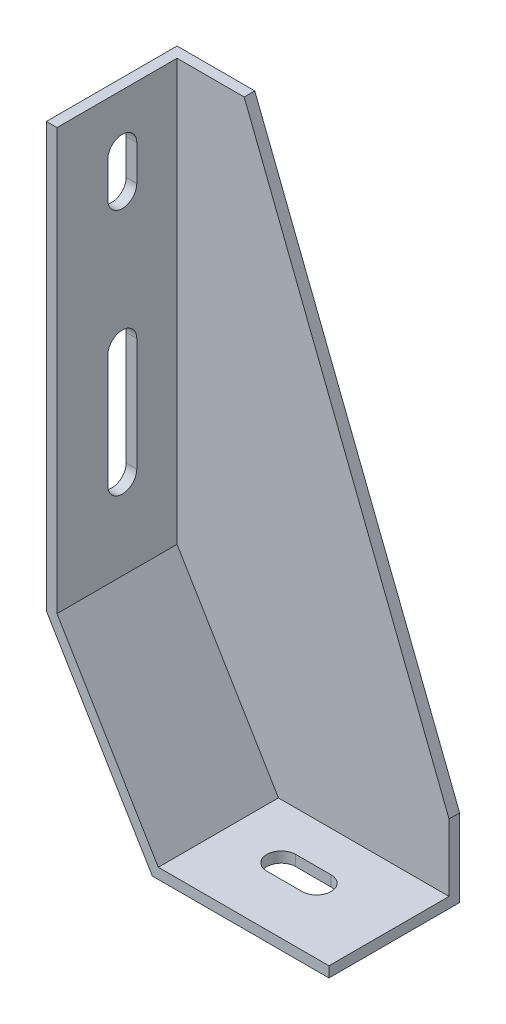
ISO-10303-21;
HEADER;
FILE_DESCRIPTION(('STEP AP214'),'2;1');
FILE_NAME('part.step','',(''),(''),'','','');
FILE_SCHEMA(('AUTOMOTIVE_DESIGN { 1 0 10303 214 1 1 1 1 }'));
ENDSEC;
DATA;
#1=APPLICATION_CONTEXT('core data for automotive mechanical design processes');
#2=APPLICATION_PROTOCOL_DEFINITION('international standard','automotive_design',2000,#1);
#3=PRODUCT_CONTEXT('',#1,'mechanical');
#4=PRODUCT('Part','Part','',(#3));
#5=PRODUCT_RELATED_PRODUCT_CATEGORY('part','',(#4));
#6=PRODUCT_DEFINITION_FORMATION('','',#4);
#7=PRODUCT_DEFINITION_CONTEXT('part definition',#1,'design');
#8=PRODUCT_DEFINITION('design','',#6,#7);
#9=PRODUCT_DEFINITION_SHAPE('','',#8);
#10=(LENGTH_UNIT() NAMED_UNIT(*) SI_UNIT(.MILLI.,.METRE.));
#11=(NAMED_UNIT(*) PLANE_ANGLE_UNIT() SI_UNIT($,.RADIAN.));
#12=(NAMED_UNIT(*) SI_UNIT($,.STERADIAN.) SOLID_ANGLE_UNIT());
#13=UNCERTAINTY_MEASURE_WITH_UNIT(LENGTH_MEASURE(1.E-05),#10,'distance_accuracy_value','');
#14=(GEOMETRIC_REPRESENTATION_CONTEXT(3) GLOBAL_UNCERTAINTY_ASSIGNED_CONTEXT((#13)) GLOBAL_UNIT_ASSIGNED_CONTEXT((#10,
#11,#12)) REPRESENTATION_CONTEXT('',''));
#15=CARTESIAN_POINT('',(0.,0.,0.));
#16=DIRECTION('',(0.,0.,1.));
#17=DIRECTION('',(1.,0.,0.));
#18=AXIS2_PLACEMENT_3D('',#15,#16,#17);
#19=CARTESIAN_POINT('',(0.,3.,37.));
#20=DIRECTION('',(0.,-1.,0.));
#21=DIRECTION('',(0.,0.,-1.));
#22=AXIS2_PLACEMENT_3D('',#19,#20,#21);
#23=PLANE('',#22);
#24=DIRECTION('',(-1.,0.,0.));
#25=VECTOR('',#24,1.);
#26=CARTESIAN_POINT('',(-22.,3.,14.4));
#27=LINE('',#26,#25);
#28=CARTESIAN_POINT('',(-22.,3.,14.4));
#29=VERTEX_POINT('',#28);
#30=CARTESIAN_POINT('',(-32.,3.,14.4));
#31=VERTEX_POINT('',#30);
#32=EDGE_CURVE('E210',#29,#31,#27,.T.);
#33=ORIENTED_EDGE('',*,*,#32,.F.);
#34=CARTESIAN_POINT('',(-22.,3.,18.5));
#35=DIRECTION('',(0.,1.,0.));
#36=DIRECTION('',(0.,0.,1.));
#37=AXIS2_PLACEMENT_3D('',#34,#35,#36);
#38=CIRCLE('',#37,4.1);
#39=CARTESIAN_POINT('',(-22.,3.,22.6));
#40=VERTEX_POINT('',#39);
#41=EDGE_CURVE('E50',#40,#29,#38,.T.);
#42=ORIENTED_EDGE('',*,*,#41,.F.);
#43=DIRECTION('',(1.,0.,0.));
#44=VECTOR('',#43,1.);
#45=CARTESIAN_POINT('',(-22.,3.,22.6));
#46=LINE('',#45,#44);
#47=CARTESIAN_POINT('',(-32.,3.,22.6));
#48=VERTEX_POINT('',#47);
#49=EDGE_CURVE('E201',#48,#40,#46,.T.);
#50=ORIENTED_EDGE('',*,*,#49,.F.);
#51=CARTESIAN_POINT('',(-32.,3.,18.5));
#52=DIRECTION('',(0.,1.,0.));
#53=DIRECTION('',(0.,0.,1.));
#54=AXIS2_PLACEMENT_3D('',#51,#52,#53);
#55=CIRCLE('',#54,4.1);
#56=EDGE_CURVE('E204',#31,#48,#55,.T.);
#57=ORIENTED_EDGE('',*,*,#56,.F.);
#58=EDGE_LOOP('',(#33,#42,#50,#57));
#59=FACE_BOUND('',#58,.T.);
#60=DIRECTION('',(-1.,0.,0.));
#61=VECTOR('',#60,1.);
#62=CARTESIAN_POINT('',(0.,3.,3.));
#63=LINE('',#62,#61);
#64=CARTESIAN_POINT('',(0.,3.,3.));
#65=VERTEX_POINT('',#64);
#66=CARTESIAN_POINT('',(-48.3014288630927,3.,3.));
#67=VERTEX_POINT('',#66);
#68=EDGE_CURVE('E295',#65,#67,#63,.T.);
#69=ORIENTED_EDGE('',*,*,#68,.T.);
#70=DIRECTION('',(0.,0.,-1.));
#71=VECTOR('',#70,1.);
#72=CARTESIAN_POINT('',(-48.3014288630927,3.,37.));
#73=LINE('',#72,#71);
#74=CARTESIAN_POINT('',(-48.3014288630927,3.,37.));
#75=VERTEX_POINT('',#74);
#76=EDGE_CURVE('E43',#75,#67,#73,.T.);
#77=ORIENTED_EDGE('',*,*,#76,.F.);
#78=DIRECTION('',(-1.,0.,0.));
#79=VECTOR('',#78,1.);
#80=CARTESIAN_POINT('',(0.,3.,37.));
#81=LINE('',#80,#79);
#82=CARTESIAN_POINT('',(0.,3.,37.));
#83=VERTEX_POINT('',#82);
#84=EDGE_CURVE('E311',#83,#75,#81,.T.);
#85=ORIENTED_EDGE('',*,*,#84,.F.);
#86=DIRECTION('',(0.,0.,-1.));
#87=VECTOR('',#86,1.);
#88=CARTESIAN_POINT('',(0.,3.,37.));
#89=LINE('',#88,#87);
#90=EDGE_CURVE('E11',#83,#65,#89,.T.);
#91=ORIENTED_EDGE('',*,*,#90,.T.);
#92=EDGE_LOOP('',(#69,#77,#85,#91));
#93=FACE_BOUND('',#92,.T.);
#94=ADVANCED_FACE('F35',(#59,#93),#23,.F.);
#95=CARTESIAN_POINT('',(-48.3014288630927,3.,37.));
#96=DIRECTION('',(-0.857492925712544,-0.514495755427527,0.));
#97=DIRECTION('',(0.514495755427527,-0.857492925712544,0.));
#98=AXIS2_PLACEMENT_3D('',#95,#96,#97);
#99=PLANE('',#98);
#100=DIRECTION('',(-0.514495755427527,0.857492925712544,0.));
#101=VECTOR('',#100,1.);
#102=CARTESIAN_POINT('',(-48.3014288630927,3.,3.));
#103=LINE('',#102,#101);
#104=CARTESIAN_POINT('',(-77.,50.8309518948454,3.));
#105=VERTEX_POINT('',#104);
#106=EDGE_CURVE('E297',#67,#105,#103,.T.);
#107=ORIENTED_EDGE('',*,*,#106,.T.);
#108=DIRECTION('',(0.,0.,-1.));
#109=VECTOR('',#108,1.);
#110=CARTESIAN_POINT('',(-77.,50.8309518948454,37.));
#111=LINE('',#110,#109);
#112=CARTESIAN_POINT('',(-77.,50.8309518948454,37.));
#113=VERTEX_POINT('',#112);
#114=EDGE_CURVE('E349',#113,#105,#111,.T.);
#115=ORIENTED_EDGE('',*,*,#114,.F.);
#116=DIRECTION('',(-0.514495755427527,0.857492925712544,0.));
#117=VECTOR('',#116,1.);
#118=CARTESIAN_POINT('',(-48.3014288630927,3.,37.));
#119=LINE('',#118,#117);
#120=EDGE_CURVE('E314',#75,#113,#119,.T.);
#121=ORIENTED_EDGE('',*,*,#120,.F.);
#122=ORIENTED_EDGE('',*,*,#76,.T.);
#123=EDGE_LOOP('',(#107,#115,#121,#122));
#124=FACE_BOUND('',#123,.T.);
#125=ADVANCED_FACE('F356',(#124),#99,.F.);
#126=CARTESIAN_POINT('',(-77.,50.8309518948454,37.));
#127=DIRECTION('',(-1.,0.,0.));
#128=DIRECTION('',(0.,0.,1.));
#129=AXIS2_PLACEMENT_3D('',#126,#127,#128);
#130=PLANE('',#129);
#131=DIRECTION('',(0.,-1.,0.));
#132=VECTOR('',#131,1.);
#133=CARTESIAN_POINT('',(-77.,107.,22.6));
#134=LINE('',#133,#132);
#135=CARTESIAN_POINT('',(-77.,107.,22.6));
#136=VERTEX_POINT('',#135);
#137=CARTESIAN_POINT('',(-77.,75.,22.6));
#138=VERTEX_POINT('',#137);
#139=EDGE_CURVE('E235',#136,#138,#134,.T.);
#140=ORIENTED_EDGE('',*,*,#139,.F.);
#141=CARTESIAN_POINT('',(-77.,107.,18.5));
#142=DIRECTION('',(1.,0.,0.));
#143=DIRECTION('',(0.,0.,-1.));
#144=AXIS2_PLACEMENT_3D('',#141,#142,#143);
#145=CIRCLE('',#144,4.1);
#146=CARTESIAN_POINT('',(-77.,107.,14.4));
#147=VERTEX_POINT('',#146);
#148=EDGE_CURVE('E216',#147,#136,#145,.T.);
#149=ORIENTED_EDGE('',*,*,#148,.F.);
#150=DIRECTION('',(0.,1.,0.));
#151=VECTOR('',#150,1.);
#152=CARTESIAN_POINT('',(-77.,107.,14.4));
#153=LINE('',#152,#151);
#154=CARTESIAN_POINT('',(-77.,75.,14.4));
#155=VERTEX_POINT('',#154);
#156=EDGE_CURVE('E224',#155,#147,#153,.T.);
#157=ORIENTED_EDGE('',*,*,#156,.F.);
#158=CARTESIAN_POINT('',(-77.,75.,18.5));
#159=DIRECTION('',(1.,0.,0.));
#160=DIRECTION('',(0.,0.,-1.));
#161=AXIS2_PLACEMENT_3D('',#158,#159,#160);
#162=CIRCLE('',#161,4.1);
#163=EDGE_CURVE('E238',#138,#155,#162,.T.);
#164=ORIENTED_EDGE('',*,*,#163,.F.);
#165=EDGE_LOOP('',(#140,#149,#157,#164));
#166=FACE_BOUND('',#165,.T.);
#167=DIRECTION('',(0.,-1.,0.));
#168=VECTOR('',#167,1.);
#169=CARTESIAN_POINT('',(-77.,155.,22.6));
#170=LINE('',#169,#168);
#171=CARTESIAN_POINT('',(-77.,155.,22.6));
#172=VERTEX_POINT('',#171);
#173=CARTESIAN_POINT('',(-77.,145.,22.6));
#174=VERTEX_POINT('',#173);
#175=EDGE_CURVE('E267',#172,#174,#170,.T.);
#176=ORIENTED_EDGE('',*,*,#175,.F.);
#177=CARTESIAN_POINT('',(-77.,155.,18.5));
#178=DIRECTION('',(1.,0.,0.));
#179=DIRECTION('',(0.,0.,-1.));
#180=AXIS2_PLACEMENT_3D('',#177,#178,#179);
#181=CIRCLE('',#180,4.1);
#182=CARTESIAN_POINT('',(-77.,155.,14.4));
#183=VERTEX_POINT('',#182);
#184=EDGE_CURVE('E245',#183,#172,#181,.T.);
#185=ORIENTED_EDGE('',*,*,#184,.F.);
#186=DIRECTION('',(0.,1.,0.));
#187=VECTOR('',#186,1.);
#188=CARTESIAN_POINT('',(-77.,155.,14.4));
#189=LINE('',#188,#187);
#190=CARTESIAN_POINT('',(-77.,145.,14.4));
#191=VERTEX_POINT('',#190);
#192=EDGE_CURVE('E256',#191,#183,#189,.T.);
#193=ORIENTED_EDGE('',*,*,#192,.F.);
#194=CARTESIAN_POINT('',(-77.,145.,18.5));
#195=DIRECTION('',(1.,0.,0.));
#196=DIRECTION('',(0.,0.,-1.));
#197=AXIS2_PLACEMENT_3D('',#194,#195,#196);
#198=CIRCLE('',#197,4.1);
#199=EDGE_CURVE('E270',#174,#191,#198,.T.);
#200=ORIENTED_EDGE('',*,*,#199,.F.);
#201=EDGE_LOOP('',(#176,#185,#193,#200));
#202=FACE_BOUND('',#201,.T.);
#203=DIRECTION('',(0.,1.,0.));
#204=VECTOR('',#203,1.);
#205=CARTESIAN_POINT('',(-77.,50.8309518948454,3.));
#206=LINE('',#205,#204);
#207=CARTESIAN_POINT('',(-77.,170.,3.));
#208=VERTEX_POINT('',#207);
#209=EDGE_CURVE('E284',#105,#208,#206,.T.);
#210=ORIENTED_EDGE('',*,*,#209,.T.);
#211=DIRECTION('',(0.,0.,-1.));
#212=VECTOR('',#211,1.);
#213=CARTESIAN_POINT('',(-77.,170.,37.));
#214=LINE('',#213,#212);
#215=CARTESIAN_POINT('',(-77.,170.,37.));
#216=VERTEX_POINT('',#215);
#217=EDGE_CURVE('E346',#216,#208,#214,.T.);
#218=ORIENTED_EDGE('',*,*,#217,.F.);
#219=DIRECTION('',(0.,1.,0.));
#220=VECTOR('',#219,1.);
#221=CARTESIAN_POINT('',(-77.,50.8309518948454,37.));
#222=LINE('',#221,#220);
#223=EDGE_CURVE('E316',#113,#216,#222,.T.);
#224=ORIENTED_EDGE('',*,*,#223,.F.);
#225=ORIENTED_EDGE('',*,*,#114,.T.);
#226=EDGE_LOOP('',(#210,#218,#224,#225));
#227=FACE_BOUND('',#226,.T.);
#228=ADVANCED_FACE('F368',(#166,#202,#227),#130,.F.);
#229=CARTESIAN_POINT('',(0.,0.,37.));
#230=DIRECTION('',(-1.,0.,0.));
#231=DIRECTION('',(0.,0.,1.));
#232=AXIS2_PLACEMENT_3D('',#229,#230,#231);
#233=PLANE('',#232);
#234=DIRECTION('',(0.,1.,0.));
#235=VECTOR('',#234,1.);
#236=CARTESIAN_POINT('',(0.,0.,0.));
#237=LINE('',#236,#235);
#238=CARTESIAN_POINT('',(0.,0.,0.));
#239=VERTEX_POINT('',#238);
#240=CARTESIAN_POINT('',(0.,22.,0.));
#241=VERTEX_POINT('',#240);
#242=EDGE_CURVE('E305',#239,#241,#237,.T.);
#243=ORIENTED_EDGE('',*,*,#242,.T.);
#244=DIRECTION('',(0.,0.,-1.));
#245=VECTOR('',#244,1.);
#246=CARTESIAN_POINT('',(0.,22.,3.));
#247=LINE('',#246,#245);
#248=CARTESIAN_POINT('',(0.,22.,3.));
#249=VERTEX_POINT('',#248);
#250=EDGE_CURVE('E302',#249,#241,#247,.T.);
#251=ORIENTED_EDGE('',*,*,#250,.F.);
#252=DIRECTION('',(0.,-1.,0.));
#253=VECTOR('',#252,1.);
#254=CARTESIAN_POINT('',(0.,3.,3.));
#255=LINE('',#254,#253);
#256=EDGE_CURVE('E292',#249,#65,#255,.T.);
#257=ORIENTED_EDGE('',*,*,#256,.T.);
#258=ORIENTED_EDGE('',*,*,#90,.F.);
#259=DIRECTION('',(0.,1.,0.));
#260=VECTOR('',#259,1.);
#261=CARTESIAN_POINT('',(0.,0.,37.));
#262=LINE('',#261,#260);
#263=CARTESIAN_POINT('',(0.,0.,37.));
#264=VERTEX_POINT('',#263);
#265=EDGE_CURVE('E308',#264,#83,#262,.T.);
#266=ORIENTED_EDGE('',*,*,#265,.F.);
#267=DIRECTION('',(0.,0.,-1.));
#268=VECTOR('',#267,1.);
#269=CARTESIAN_POINT('',(0.,0.,37.));
#270=LINE('',#269,#268);
#271=EDGE_CURVE('E326',#264,#239,#270,.T.);
#272=ORIENTED_EDGE('',*,*,#271,.T.);
#273=EDGE_LOOP('',(#243,#251,#257,#258,#266,#272));
#274=FACE_BOUND('',#273,.T.);
#275=ADVANCED_FACE('F37',(#274),#233,.F.);
#276=CARTESIAN_POINT('',(-77.,170.,37.));
#277=DIRECTION('',(0.,-1.,0.));
#278=DIRECTION('',(0.,0.,-1.));
#279=AXIS2_PLACEMENT_3D('',#276,#277,#278);
#280=PLANE('',#279);
#281=DIRECTION('',(-1.,0.,0.));
#282=VECTOR('',#281,1.);
#283=CARTESIAN_POINT('',(-77.,170.,0.));
#284=LINE('',#283,#282);
#285=CARTESIAN_POINT('',(-58.,170.,0.));
#286=VERTEX_POINT('',#285);
#287=CARTESIAN_POINT('',(-80.,170.,0.));
#288=VERTEX_POINT('',#287);
#289=EDGE_CURVE('E328',#286,#288,#284,.T.);
#290=ORIENTED_EDGE('',*,*,#289,.T.);
#291=DIRECTION('',(0.,0.,-1.));
#292=VECTOR('',#291,1.);
#293=CARTESIAN_POINT('',(-80.,170.,37.));
#294=LINE('',#293,#292);
#295=CARTESIAN_POINT('',(-80.,170.,37.));
#296=VERTEX_POINT('',#295);
#297=EDGE_CURVE('E343',#296,#288,#294,.T.);
#298=ORIENTED_EDGE('',*,*,#297,.F.);
#299=DIRECTION('',(-1.,0.,0.));
#300=VECTOR('',#299,1.);
#301=CARTESIAN_POINT('',(-77.,170.,37.));
#302=LINE('',#301,#300);
#303=EDGE_CURVE('E318',#216,#296,#302,.T.);
#304=ORIENTED_EDGE('',*,*,#303,.F.);
#305=ORIENTED_EDGE('',*,*,#217,.T.);
#306=DIRECTION('',(1.,0.,0.));
#307=VECTOR('',#306,1.);
#308=CARTESIAN_POINT('',(-77.,170.,3.));
#309=LINE('',#308,#307);
#310=CARTESIAN_POINT('',(-58.,170.,3.));
#311=VERTEX_POINT('',#310);
#312=EDGE_CURVE('E286',#208,#311,#309,.T.);
#313=ORIENTED_EDGE('',*,*,#312,.T.);
#314=DIRECTION('',(0.,0.,-1.));
#315=VECTOR('',#314,1.);
#316=CARTESIAN_POINT('',(-58.,170.,3.));
#317=LINE('',#316,#315);
#318=EDGE_CURVE('E299',#311,#286,#317,.T.);
#319=ORIENTED_EDGE('',*,*,#318,.T.);
#320=EDGE_LOOP('',(#290,#298,#304,#305,#313,#319));
#321=FACE_BOUND('',#320,.T.);
#322=ADVANCED_FACE('F372',(#321),#280,.F.);
#323=CARTESIAN_POINT('',(-80.,170.,37.));
#324=DIRECTION('',(1.,0.,0.));
#325=DIRECTION('',(0.,0.,-1.));
#326=AXIS2_PLACEMENT_3D('',#323,#324,#325);
#327=PLANE('',#326);
#328=DIRECTION('',(0.,1.,0.));
#329=VECTOR('',#328,1.);
#330=CARTESIAN_POINT('',(-80.,107.,14.4));
#331=LINE('',#330,#329);
#332=CARTESIAN_POINT('',(-80.,75.,14.4));
#333=VERTEX_POINT('',#332);
#334=CARTESIAN_POINT('',(-80.,107.,14.4));
#335=VERTEX_POINT('',#334);
#336=EDGE_CURVE('E230',#333,#335,#331,.T.);
#337=ORIENTED_EDGE('',*,*,#336,.T.);
#338=CARTESIAN_POINT('',(-80.,107.,18.5));
#339=DIRECTION('',(1.,0.,0.));
#340=DIRECTION('',(0.,0.,-1.));
#341=AXIS2_PLACEMENT_3D('',#338,#339,#340);
#342=CIRCLE('',#341,4.1);
#343=CARTESIAN_POINT('',(-80.,107.,22.6));
#344=VERTEX_POINT('',#343);
#345=EDGE_CURVE('E220',#335,#344,#342,.T.);
#346=ORIENTED_EDGE('',*,*,#345,.T.);
#347=DIRECTION('',(0.,-1.,0.));
#348=VECTOR('',#347,1.);
#349=CARTESIAN_POINT('',(-80.,107.,22.6));
#350=LINE('',#349,#348);
#351=CARTESIAN_POINT('',(-80.,75.,22.6));
#352=VERTEX_POINT('',#351);
#353=EDGE_CURVE('E223',#344,#352,#350,.T.);
#354=ORIENTED_EDGE('',*,*,#353,.T.);
#355=CARTESIAN_POINT('',(-80.,75.,18.5));
#356=DIRECTION('',(1.,0.,0.));
#357=DIRECTION('',(0.,0.,-1.));
#358=AXIS2_PLACEMENT_3D('',#355,#356,#357);
#359=CIRCLE('',#358,4.1);
#360=EDGE_CURVE('E227',#352,#333,#359,.T.);
#361=ORIENTED_EDGE('',*,*,#360,.T.);
#362=EDGE_LOOP('',(#337,#346,#354,#361));
#363=FACE_BOUND('',#362,.T.);
#364=DIRECTION('',(0.,1.,0.));
#365=VECTOR('',#364,1.);
#366=CARTESIAN_POINT('',(-80.,155.,14.4));
#367=LINE('',#366,#365);
#368=CARTESIAN_POINT('',(-80.,145.,14.4));
#369=VERTEX_POINT('',#368);
#370=CARTESIAN_POINT('',(-80.,155.,14.4));
#371=VERTEX_POINT('',#370);
#372=EDGE_CURVE('E262',#369,#371,#367,.T.);
#373=ORIENTED_EDGE('',*,*,#372,.T.);
#374=CARTESIAN_POINT('',(-80.,155.,18.5));
#375=DIRECTION('',(1.,0.,0.));
#376=DIRECTION('',(0.,0.,-1.));
#377=AXIS2_PLACEMENT_3D('',#374,#375,#376);
#378=CIRCLE('',#377,4.1);
#379=CARTESIAN_POINT('',(-80.,155.,22.6));
#380=VERTEX_POINT('',#379);
#381=EDGE_CURVE('E252',#371,#380,#378,.T.);
#382=ORIENTED_EDGE('',*,*,#381,.T.);
#383=DIRECTION('',(0.,-1.,0.));
#384=VECTOR('',#383,1.);
#385=CARTESIAN_POINT('',(-80.,155.,22.6));
#386=LINE('',#385,#384);
#387=CARTESIAN_POINT('',(-80.,145.,22.6));
#388=VERTEX_POINT('',#387);
#389=EDGE_CURVE('E255',#380,#388,#386,.T.);
#390=ORIENTED_EDGE('',*,*,#389,.T.);
#391=CARTESIAN_POINT('',(-80.,145.,18.5));
#392=DIRECTION('',(1.,0.,0.));
#393=DIRECTION('',(0.,0.,-1.));
#394=AXIS2_PLACEMENT_3D('',#391,#392,#393);
#395=CIRCLE('',#394,4.1);
#396=EDGE_CURVE('E259',#388,#369,#395,.T.);
#397=ORIENTED_EDGE('',*,*,#396,.T.);
#398=EDGE_LOOP('',(#373,#382,#390,#397));
#399=FACE_BOUND('',#398,.T.);
#400=DIRECTION('',(0.,-1.,0.));
#401=VECTOR('',#400,1.);
#402=CARTESIAN_POINT('',(-80.,170.,0.));
#403=LINE('',#402,#401);
#404=CARTESIAN_POINT('',(-80.,50.,0.));
#405=VERTEX_POINT('',#404);
#406=EDGE_CURVE('E330',#288,#405,#403,.T.);
#407=ORIENTED_EDGE('',*,*,#406,.T.);
#408=DIRECTION('',(0.,0.,-1.));
#409=VECTOR('',#408,1.);
#410=CARTESIAN_POINT('',(-80.,50.,37.));
#411=LINE('',#410,#409);
#412=CARTESIAN_POINT('',(-80.,50.,37.));
#413=VERTEX_POINT('',#412);
#414=EDGE_CURVE('E340',#413,#405,#411,.T.);
#415=ORIENTED_EDGE('',*,*,#414,.F.);
#416=DIRECTION('',(0.,-1.,0.));
#417=VECTOR('',#416,1.);
#418=CARTESIAN_POINT('',(-80.,170.,37.));
#419=LINE('',#418,#417);
#420=EDGE_CURVE('E320',#296,#413,#419,.T.);
#421=ORIENTED_EDGE('',*,*,#420,.F.);
#422=ORIENTED_EDGE('',*,*,#297,.T.);
#423=EDGE_LOOP('',(#407,#415,#421,#422));
#424=FACE_BOUND('',#423,.T.);
#425=ADVANCED_FACE('F387',(#363,#399,#424),#327,.F.);
#426=CARTESIAN_POINT('',(-80.,50.,37.));
#427=DIRECTION('',(0.857492925712544,0.514495755427526,0.));
#428=DIRECTION('',(-0.514495755427526,0.857492925712544,0.));
#429=AXIS2_PLACEMENT_3D('',#426,#427,#428);
#430=PLANE('',#429);
#431=DIRECTION('',(0.514495755427526,-0.857492925712544,0.));
#432=VECTOR('',#431,1.);
#433=CARTESIAN_POINT('',(-80.,50.,0.));
#434=LINE('',#433,#432);
#435=CARTESIAN_POINT('',(-50.,0.,0.));
#436=VERTEX_POINT('',#435);
#437=EDGE_CURVE('E332',#405,#436,#434,.T.);
#438=ORIENTED_EDGE('',*,*,#437,.T.);
#439=DIRECTION('',(0.,0.,-1.));
#440=VECTOR('',#439,1.);
#441=CARTESIAN_POINT('',(-50.,0.,37.));
#442=LINE('',#441,#440);
#443=CARTESIAN_POINT('',(-50.,0.,37.));
#444=VERTEX_POINT('',#443);
#445=EDGE_CURVE('E337',#444,#436,#442,.T.);
#446=ORIENTED_EDGE('',*,*,#445,.F.);
#447=DIRECTION('',(0.514495755427526,-0.857492925712544,0.));
#448=VECTOR('',#447,1.);
#449=CARTESIAN_POINT('',(-80.,50.,37.));
#450=LINE('',#449,#448);
#451=EDGE_CURVE('E322',#413,#444,#450,.T.);
#452=ORIENTED_EDGE('',*,*,#451,.F.);
#453=ORIENTED_EDGE('',*,*,#414,.T.);
#454=EDGE_LOOP('',(#438,#446,#452,#453));
#455=FACE_BOUND('',#454,.T.);
#456=ADVANCED_FACE('F394',(#455),#430,.F.);
#457=CARTESIAN_POINT('',(-50.,0.,37.));
#458=DIRECTION('',(0.,1.,0.));
#459=DIRECTION('',(0.,0.,1.));
#460=AXIS2_PLACEMENT_3D('',#457,#458,#459);
#461=PLANE('',#460);
#462=DIRECTION('',(1.,0.,0.));
#463=VECTOR('',#462,1.);
#464=CARTESIAN_POINT('',(-22.,0.,22.6));
#465=LINE('',#464,#463);
#466=CARTESIAN_POINT('',(-32.,0.,22.6));
#467=VERTEX_POINT('',#466);
#468=CARTESIAN_POINT('',(-22.,0.,22.6));
#469=VERTEX_POINT('',#468);
#470=EDGE_CURVE('E191',#467,#469,#465,.T.);
#471=ORIENTED_EDGE('',*,*,#470,.T.);
#472=CARTESIAN_POINT('',(-22.,0.,18.5));
#473=DIRECTION('',(0.,1.,0.));
#474=DIRECTION('',(0.,0.,1.));
#475=AXIS2_PLACEMENT_3D('',#472,#473,#474);
#476=CIRCLE('',#475,4.1);
#477=CARTESIAN_POINT('',(-22.,0.,14.4));
#478=VERTEX_POINT('',#477);
#479=EDGE_CURVE('E185',#469,#478,#476,.T.);
#480=ORIENTED_EDGE('',*,*,#479,.T.);
#481=DIRECTION('',(-1.,0.,0.));
#482=VECTOR('',#481,1.);
#483=CARTESIAN_POINT('',(-22.,0.,14.4));
#484=LINE('',#483,#482);
#485=CARTESIAN_POINT('',(-32.,0.,14.4));
#486=VERTEX_POINT('',#485);
#487=EDGE_CURVE('E194',#478,#486,#484,.T.);
#488=ORIENTED_EDGE('',*,*,#487,.T.);
#489=CARTESIAN_POINT('',(-32.,0.,18.5));
#490=DIRECTION('',(0.,1.,0.));
#491=DIRECTION('',(0.,0.,1.));
#492=AXIS2_PLACEMENT_3D('',#489,#490,#491);
#493=CIRCLE('',#492,4.1);
#494=EDGE_CURVE('E58',#486,#467,#493,.T.);
#495=ORIENTED_EDGE('',*,*,#494,.T.);
#496=EDGE_LOOP('',(#471,#480,#488,#495));
#497=FACE_BOUND('',#496,.T.);
#498=DIRECTION('',(1.,0.,0.));
#499=VECTOR('',#498,1.);
#500=CARTESIAN_POINT('',(-50.,0.,0.));
#501=LINE('',#500,#499);
#502=EDGE_CURVE('E312',#436,#239,#501,.T.);
#503=ORIENTED_EDGE('',*,*,#502,.T.);
#504=ORIENTED_EDGE('',*,*,#271,.F.);
#505=DIRECTION('',(1.,0.,0.));
#506=VECTOR('',#505,1.);
#507=CARTESIAN_POINT('',(-50.,0.,37.));
#508=LINE('',#507,#506);
#509=EDGE_CURVE('E324',#444,#264,#508,.T.);
#510=ORIENTED_EDGE('',*,*,#509,.F.);
#511=ORIENTED_EDGE('',*,*,#445,.T.);
#512=EDGE_LOOP('',(#503,#504,#510,#511));
#513=FACE_BOUND('',#512,.T.);
#514=ADVANCED_FACE('F198',(#497,#513),#461,.F.);
#515=CARTESIAN_POINT('',(0.,0.,37.));
#516=DIRECTION('',(0.,0.,1.));
#517=DIRECTION('',(1.,0.,0.));
#518=AXIS2_PLACEMENT_3D('',#515,#516,#517);
#519=PLANE('',#518);
#520=ORIENTED_EDGE('',*,*,#265,.T.);
#521=ORIENTED_EDGE('',*,*,#84,.T.);
#522=ORIENTED_EDGE('',*,*,#120,.T.);
#523=ORIENTED_EDGE('',*,*,#223,.T.);
#524=ORIENTED_EDGE('',*,*,#303,.T.);
#525=ORIENTED_EDGE('',*,*,#420,.T.);
#526=ORIENTED_EDGE('',*,*,#451,.T.);
#527=ORIENTED_EDGE('',*,*,#509,.T.);
#528=EDGE_LOOP('',(#520,#521,#522,#523,#524,#525,#526,#527));
#529=FACE_BOUND('',#528,.T.);
#530=ADVANCED_FACE('F376',(#529),#519,.T.);
#531=CARTESIAN_POINT('',(0.,0.,0.));
#532=DIRECTION('',(0.,0.,1.));
#533=DIRECTION('',(1.,0.,0.));
#534=AXIS2_PLACEMENT_3D('',#531,#532,#533);
#535=PLANE('',#534);
#536=ORIENTED_EDGE('',*,*,#289,.F.);
#537=DIRECTION('',(0.364873698983945,-0.931057024993514,0.));
#538=VECTOR('',#537,1.);
#539=CARTESIAN_POINT('',(-58.,170.,0.));
#540=LINE('',#539,#538);
#541=EDGE_CURVE('E277',#286,#241,#540,.T.);
#542=ORIENTED_EDGE('',*,*,#541,.T.);
#543=ORIENTED_EDGE('',*,*,#242,.F.);
#544=ORIENTED_EDGE('',*,*,#502,.F.);
#545=ORIENTED_EDGE('',*,*,#437,.F.);
#546=ORIENTED_EDGE('',*,*,#406,.F.);
#547=EDGE_LOOP('',(#536,#542,#543,#544,#545,#546));
#548=FACE_BOUND('',#547,.T.);
#549=ADVANCED_FACE('F389',(#548),#535,.F.);
#550=CARTESIAN_POINT('',(-58.,170.,3.));
#551=DIRECTION('',(0.931057024993514,0.364873698983945,0.));
#552=DIRECTION('',(-0.364873698983945,0.931057024993515,0.));
#553=AXIS2_PLACEMENT_3D('',#550,#551,#552);
#554=PLANE('',#553);
#555=ORIENTED_EDGE('',*,*,#541,.F.);
#556=ORIENTED_EDGE('',*,*,#318,.F.);
#557=DIRECTION('',(0.364873698983945,-0.931057024993514,0.));
#558=VECTOR('',#557,1.);
#559=CARTESIAN_POINT('',(-58.,170.,3.));
#560=LINE('',#559,#558);
#561=EDGE_CURVE('E289',#311,#249,#560,.T.);
#562=ORIENTED_EDGE('',*,*,#561,.T.);
#563=ORIENTED_EDGE('',*,*,#250,.T.);
#564=EDGE_LOOP('',(#555,#556,#562,#563));
#565=FACE_BOUND('',#564,.T.);
#566=ADVANCED_FACE('F383',(#565),#554,.T.);
#567=CARTESIAN_POINT('',(0.,0.,3.));
#568=DIRECTION('',(0.,0.,-1.));
#569=DIRECTION('',(-1.,0.,0.));
#570=AXIS2_PLACEMENT_3D('',#567,#568,#569);
#571=PLANE('',#570);
#572=ORIENTED_EDGE('',*,*,#209,.F.);
#573=ORIENTED_EDGE('',*,*,#106,.F.);
#574=ORIENTED_EDGE('',*,*,#68,.F.);
#575=ORIENTED_EDGE('',*,*,#256,.F.);
#576=ORIENTED_EDGE('',*,*,#561,.F.);
#577=ORIENTED_EDGE('',*,*,#312,.F.);
#578=EDGE_LOOP('',(#572,#573,#574,#575,#576,#577));
#579=FACE_BOUND('',#578,.T.);
#580=ADVANCED_FACE('F362',(#579),#571,.F.);
#581=CARTESIAN_POINT('',(-80.,155.,18.5));
#582=DIRECTION('',(1.,0.,0.));
#583=DIRECTION('',(0.,0.,-1.));
#584=AXIS2_PLACEMENT_3D('',#581,#582,#583);
#585=CYLINDRICAL_SURFACE('',#584,4.1);
#586=ORIENTED_EDGE('',*,*,#184,.T.);
#587=DIRECTION('',(1.,0.,0.));
#588=VECTOR('',#587,1.);
#589=CARTESIAN_POINT('',(-80.,155.,22.6));
#590=LINE('',#589,#588);
#591=EDGE_CURVE('E265',#380,#172,#590,.T.);
#592=ORIENTED_EDGE('',*,*,#591,.F.);
#593=ORIENTED_EDGE('',*,*,#381,.F.);
#594=DIRECTION('',(1.,0.,0.));
#595=VECTOR('',#594,1.);
#596=CARTESIAN_POINT('',(-80.,155.,14.4));
#597=LINE('',#596,#595);
#598=EDGE_CURVE('E275',#371,#183,#597,.T.);
#599=ORIENTED_EDGE('',*,*,#598,.T.);
#600=EDGE_LOOP('',(#586,#592,#593,#599));
#601=FACE_BOUND('',#600,.T.);
#602=ADVANCED_FACE('F432',(#601),#585,.F.);
#603=CARTESIAN_POINT('',(-80.,155.,14.4));
#604=DIRECTION('',(0.,0.,-1.));
#605=DIRECTION('',(-1.,0.,0.));
#606=AXIS2_PLACEMENT_3D('',#603,#604,#605);
#607=PLANE('',#606);
#608=ORIENTED_EDGE('',*,*,#192,.T.);
#609=ORIENTED_EDGE('',*,*,#598,.F.);
#610=ORIENTED_EDGE('',*,*,#372,.F.);
#611=DIRECTION('',(1.,0.,0.));
#612=VECTOR('',#611,1.);
#613=CARTESIAN_POINT('',(-80.,145.,14.4));
#614=LINE('',#613,#612);
#615=EDGE_CURVE('E278',#369,#191,#614,.T.);
#616=ORIENTED_EDGE('',*,*,#615,.T.);
#617=EDGE_LOOP('',(#608,#609,#610,#616));
#618=FACE_BOUND('',#617,.T.);
#619=ADVANCED_FACE('F428',(#618),#607,.F.);
#620=CARTESIAN_POINT('',(-80.,145.,18.5));
#621=DIRECTION('',(1.,0.,0.));
#622=DIRECTION('',(0.,0.,-1.));
#623=AXIS2_PLACEMENT_3D('',#620,#621,#622);
#624=CYLINDRICAL_SURFACE('',#623,4.1);
#625=ORIENTED_EDGE('',*,*,#199,.T.);
#626=ORIENTED_EDGE('',*,*,#615,.F.);
#627=ORIENTED_EDGE('',*,*,#396,.F.);
#628=DIRECTION('',(1.,0.,0.));
#629=VECTOR('',#628,1.);
#630=CARTESIAN_POINT('',(-80.,145.,22.6));
#631=LINE('',#630,#629);
#632=EDGE_CURVE('E280',#388,#174,#631,.T.);
#633=ORIENTED_EDGE('',*,*,#632,.T.);
#634=EDGE_LOOP('',(#625,#626,#627,#633));
#635=FACE_BOUND('',#634,.T.);
#636=ADVANCED_FACE('F440',(#635),#624,.F.);
#637=CARTESIAN_POINT('',(-80.,155.,22.6));
#638=DIRECTION('',(0.,0.,1.));
#639=DIRECTION('',(0.,-1.,0.));
#640=AXIS2_PLACEMENT_3D('',#637,#638,#639);
#641=PLANE('',#640);
#642=ORIENTED_EDGE('',*,*,#175,.T.);
#643=ORIENTED_EDGE('',*,*,#632,.F.);
#644=ORIENTED_EDGE('',*,*,#389,.F.);
#645=ORIENTED_EDGE('',*,*,#591,.T.);
#646=EDGE_LOOP('',(#642,#643,#644,#645));
#647=FACE_BOUND('',#646,.T.);
#648=ADVANCED_FACE('F437',(#647),#641,.F.);
#649=CARTESIAN_POINT('',(-80.,107.,18.5));
#650=DIRECTION('',(1.,0.,0.));
#651=DIRECTION('',(0.,0.,-1.));
#652=AXIS2_PLACEMENT_3D('',#649,#650,#651);
#653=CYLINDRICAL_SURFACE('',#652,4.1);
#654=ORIENTED_EDGE('',*,*,#148,.T.);
#655=DIRECTION('',(1.,0.,0.));
#656=VECTOR('',#655,1.);
#657=CARTESIAN_POINT('',(-80.,107.,22.6));
#658=LINE('',#657,#656);
#659=EDGE_CURVE('E233',#344,#136,#658,.T.);
#660=ORIENTED_EDGE('',*,*,#659,.F.);
#661=ORIENTED_EDGE('',*,*,#345,.F.);
#662=DIRECTION('',(1.,0.,0.));
#663=VECTOR('',#662,1.);
#664=CARTESIAN_POINT('',(-80.,107.,14.4));
#665=LINE('',#664,#663);
#666=EDGE_CURVE('E243',#335,#147,#665,.T.);
#667=ORIENTED_EDGE('',*,*,#666,.T.);
#668=EDGE_LOOP('',(#654,#660,#661,#667));
#669=FACE_BOUND('',#668,.T.);
#670=ADVANCED_FACE('F448',(#669),#653,.F.);
#671=CARTESIAN_POINT('',(-80.,107.,14.4));
#672=DIRECTION('',(0.,0.,-1.));
#673=DIRECTION('',(0.,1.,0.));
#674=AXIS2_PLACEMENT_3D('',#671,#672,#673);
#675=PLANE('',#674);
#676=ORIENTED_EDGE('',*,*,#156,.T.);
#677=ORIENTED_EDGE('',*,*,#666,.F.);
#678=ORIENTED_EDGE('',*,*,#336,.F.);
#679=DIRECTION('',(1.,0.,0.));
#680=VECTOR('',#679,1.);
#681=CARTESIAN_POINT('',(-80.,75.,14.4));
#682=LINE('',#681,#680);
#683=EDGE_CURVE('E246',#333,#155,#682,.T.);
#684=ORIENTED_EDGE('',*,*,#683,.T.);
#685=EDGE_LOOP('',(#676,#677,#678,#684));
#686=FACE_BOUND('',#685,.T.);
#687=ADVANCED_FACE('F500',(#686),#675,.F.);
#688=CARTESIAN_POINT('',(-80.,75.,18.5));
#689=DIRECTION('',(1.,0.,0.));
#690=DIRECTION('',(0.,0.,-1.));
#691=AXIS2_PLACEMENT_3D('',#688,#689,#690);
#692=CYLINDRICAL_SURFACE('',#691,4.1);
#693=ORIENTED_EDGE('',*,*,#163,.T.);
#694=ORIENTED_EDGE('',*,*,#683,.F.);
#695=ORIENTED_EDGE('',*,*,#360,.F.);
#696=DIRECTION('',(1.,0.,0.));
#697=VECTOR('',#696,1.);
#698=CARTESIAN_POINT('',(-80.,75.,22.6));
#699=LINE('',#698,#697);
#700=EDGE_CURVE('E248',#352,#138,#699,.T.);
#701=ORIENTED_EDGE('',*,*,#700,.T.);
#702=EDGE_LOOP('',(#693,#694,#695,#701));
#703=FACE_BOUND('',#702,.T.);
#704=ADVANCED_FACE('F509',(#703),#692,.F.);
#705=CARTESIAN_POINT('',(-80.,107.,22.6));
#706=DIRECTION('',(0.,0.,1.));
#707=DIRECTION('',(0.,-1.,0.));
#708=AXIS2_PLACEMENT_3D('',#705,#706,#707);
#709=PLANE('',#708);
#710=ORIENTED_EDGE('',*,*,#139,.T.);
#711=ORIENTED_EDGE('',*,*,#700,.F.);
#712=ORIENTED_EDGE('',*,*,#353,.F.);
#713=ORIENTED_EDGE('',*,*,#659,.T.);
#714=EDGE_LOOP('',(#710,#711,#712,#713));
#715=FACE_BOUND('',#714,.T.);
#716=ADVANCED_FACE('F519',(#715),#709,.F.);
#717=CARTESIAN_POINT('',(-22.,0.,18.5));
#718=DIRECTION('',(0.,1.,0.));
#719=DIRECTION('',(0.,0.,1.));
#720=AXIS2_PLACEMENT_3D('',#717,#718,#719);
#721=CYLINDRICAL_SURFACE('',#720,4.1);
#722=ORIENTED_EDGE('',*,*,#41,.T.);
#723=DIRECTION('',(0.,1.,0.));
#724=VECTOR('',#723,1.);
#725=CARTESIAN_POINT('',(-22.,0.,14.4));
#726=LINE('',#725,#724);
#727=EDGE_CURVE('E181',#478,#29,#726,.T.);
#728=ORIENTED_EDGE('',*,*,#727,.F.);
#729=ORIENTED_EDGE('',*,*,#479,.F.);
#730=DIRECTION('',(0.,1.,0.));
#731=VECTOR('',#730,1.);
#732=CARTESIAN_POINT('',(-22.,0.,22.6));
#733=LINE('',#732,#731);
#734=EDGE_CURVE('E214',#469,#40,#733,.T.);
#735=ORIENTED_EDGE('',*,*,#734,.T.);
#736=EDGE_LOOP('',(#722,#728,#729,#735));
#737=FACE_BOUND('',#736,.T.);
#738=ADVANCED_FACE('F183',(#737),#721,.F.);
#739=CARTESIAN_POINT('',(-22.,0.,22.6));
#740=DIRECTION('',(0.,0.,1.));
#741=DIRECTION('',(1.,0.,0.));
#742=AXIS2_PLACEMENT_3D('',#739,#740,#741);
#743=PLANE('',#742);
#744=ORIENTED_EDGE('',*,*,#49,.T.);
#745=ORIENTED_EDGE('',*,*,#734,.F.);
#746=ORIENTED_EDGE('',*,*,#470,.F.);
#747=DIRECTION('',(0.,1.,0.));
#748=VECTOR('',#747,1.);
#749=CARTESIAN_POINT('',(-32.,0.,22.6));
#750=LINE('',#749,#748);
#751=EDGE_CURVE('E217',#467,#48,#750,.T.);
#752=ORIENTED_EDGE('',*,*,#751,.T.);
#753=EDGE_LOOP('',(#744,#745,#746,#752));
#754=FACE_BOUND('',#753,.T.);
#755=ADVANCED_FACE('F550',(#754),#743,.F.);
#756=CARTESIAN_POINT('',(-32.,0.,18.5));
#757=DIRECTION('',(0.,1.,0.));
#758=DIRECTION('',(0.,0.,1.));
#759=AXIS2_PLACEMENT_3D('',#756,#757,#758);
#760=CYLINDRICAL_SURFACE('',#759,4.1);
#761=ORIENTED_EDGE('',*,*,#56,.T.);
#762=ORIENTED_EDGE('',*,*,#751,.F.);
#763=ORIENTED_EDGE('',*,*,#494,.F.);
#764=DIRECTION('',(0.,1.,0.));
#765=VECTOR('',#764,1.);
#766=CARTESIAN_POINT('',(-32.,0.,14.4));
#767=LINE('',#766,#765);
#768=EDGE_CURVE('E190',#486,#31,#767,.T.);
#769=ORIENTED_EDGE('',*,*,#768,.T.);
#770=EDGE_LOOP('',(#761,#762,#763,#769));
#771=FACE_BOUND('',#770,.T.);
#772=ADVANCED_FACE('F559',(#771),#760,.F.);
#773=CARTESIAN_POINT('',(-22.,0.,14.4));
#774=DIRECTION('',(0.,0.,-1.));
#775=DIRECTION('',(-1.,0.,0.));
#776=AXIS2_PLACEMENT_3D('',#773,#774,#775);
#777=PLANE('',#776);
#778=ORIENTED_EDGE('',*,*,#32,.T.);
#779=ORIENTED_EDGE('',*,*,#768,.F.);
#780=ORIENTED_EDGE('',*,*,#487,.F.);
#781=ORIENTED_EDGE('',*,*,#727,.T.);
#782=EDGE_LOOP('',(#778,#779,#780,#781));
#783=FACE_BOUND('',#782,.T.);
#784=ADVANCED_FACE('F195',(#783),#777,.F.);
#785=CLOSED_SHELL('',(#94,#125,#228,#275,#322,#425,#456,#514,#530,#549,#566,#580,#602,#619,#636,
#648,#670,#687,#704,#716,#738,#755,#772,#784));
#786=MANIFOLD_SOLID_BREP('B2',#785);
#787=ADVANCED_BREP_SHAPE_REPRESENTATION('',(#18,#786),#14);
#788=SHAPE_DEFINITION_REPRESENTATION(#9,#787);
ENDSEC;
END-ISO-10303-21;
